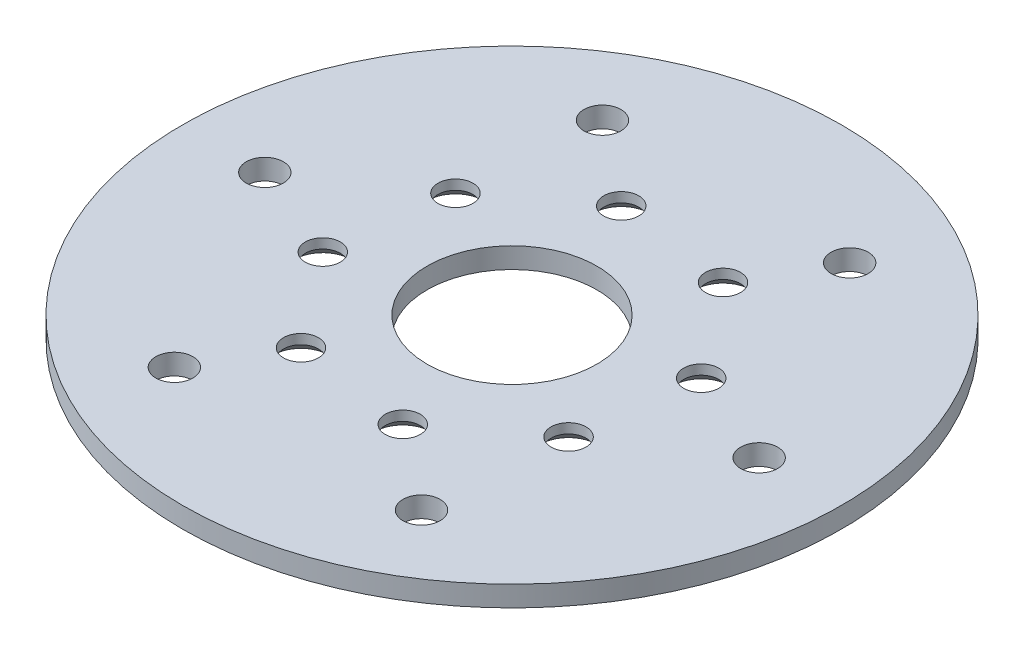
ISO-10303-21;
HEADER;
FILE_DESCRIPTION(('STEP AP214'),'2;1');
FILE_NAME('part.step','',(''),(''),'','','');
FILE_SCHEMA(('AUTOMOTIVE_DESIGN { 1 0 10303 214 1 1 1 1 }'));
ENDSEC;
DATA;
#1=APPLICATION_CONTEXT('core data for automotive mechanical design processes');
#2=APPLICATION_PROTOCOL_DEFINITION('international standard','automotive_design',2000,#1);
#3=PRODUCT_CONTEXT('',#1,'mechanical');
#4=PRODUCT('Part','Part','',(#3));
#5=PRODUCT_RELATED_PRODUCT_CATEGORY('part','',(#4));
#6=PRODUCT_DEFINITION_FORMATION('','',#4);
#7=PRODUCT_DEFINITION_CONTEXT('part definition',#1,'design');
#8=PRODUCT_DEFINITION('design','',#6,#7);
#9=PRODUCT_DEFINITION_SHAPE('','',#8);
#10=(LENGTH_UNIT() NAMED_UNIT(*) SI_UNIT(.MILLI.,.METRE.));
#11=(NAMED_UNIT(*) PLANE_ANGLE_UNIT() SI_UNIT($,.RADIAN.));
#12=(NAMED_UNIT(*) SI_UNIT($,.STERADIAN.) SOLID_ANGLE_UNIT());
#13=UNCERTAINTY_MEASURE_WITH_UNIT(LENGTH_MEASURE(1.E-05),#10,'distance_accuracy_value','');
#14=(GEOMETRIC_REPRESENTATION_CONTEXT(3) GLOBAL_UNCERTAINTY_ASSIGNED_CONTEXT((#13)) GLOBAL_UNIT_ASSIGNED_CONTEXT((#10,
#11,#12)) REPRESENTATION_CONTEXT('',''));
#15=CARTESIAN_POINT('',(0.,0.,0.));
#16=DIRECTION('',(0.,0.,1.));
#17=DIRECTION('',(1.,0.,0.));
#18=AXIS2_PLACEMENT_3D('',#15,#16,#17);
#19=CARTESIAN_POINT('',(0.,0.,0.));
#20=DIRECTION('',(0.,1.,0.));
#21=DIRECTION('',(0.,0.,1.));
#22=AXIS2_PLACEMENT_3D('',#19,#20,#21);
#23=PLANE('',#22);
#24=CARTESIAN_POINT('',(-3.88228567653796,0.,-14.4888873943352));
#25=DIRECTION('',(0.,-1.,0.));
#26=DIRECTION('',(0.,0.,-1.));
#27=AXIS2_PLACEMENT_3D('',#24,#25,#26);
#28=CIRCLE('',#27,2.75);
#29=CARTESIAN_POINT('',(-3.88228567653796,0.,-17.2388873943352));
#30=VERTEX_POINT('',#29);
#31=EDGE_CURVE('E55',#30,#30,#28,.T.);
#32=ORIENTED_EDGE('',*,*,#31,.F.);
#33=EDGE_LOOP('',(#32));
#34=FACE_BOUND('',#33,.T.);
#35=CARTESIAN_POINT('',(0.,0.,0.));
#36=DIRECTION('',(0.,1.,0.));
#37=DIRECTION('',(0.,0.,1.));
#38=AXIS2_PLACEMENT_3D('',#35,#36,#37);
#39=CIRCLE('',#38,32.);
#40=CARTESIAN_POINT('',(0.,0.,32.));
#41=VERTEX_POINT('',#40);
#42=EDGE_CURVE('E35',#41,#41,#39,.T.);
#43=ORIENTED_EDGE('',*,*,#42,.F.);
#44=EDGE_LOOP('',(#43));
#45=FACE_BOUND('',#44,.T.);
#46=CARTESIAN_POINT('',(0.,0.,0.));
#47=DIRECTION('',(0.,1.,0.));
#48=DIRECTION('',(0.,0.,1.));
#49=AXIS2_PLACEMENT_3D('',#46,#47,#48);
#50=CIRCLE('',#49,8.25);
#51=CARTESIAN_POINT('',(0.,0.,8.25));
#52=VERTEX_POINT('',#51);
#53=EDGE_CURVE('E44',#52,#52,#50,.T.);
#54=ORIENTED_EDGE('',*,*,#53,.T.);
#55=EDGE_LOOP('',(#54));
#56=FACE_BOUND('',#55,.T.);
#57=CARTESIAN_POINT('',(-12.9903810567662,0.,-7.49999999999852));
#58=DIRECTION('',(0.,-1.,0.));
#59=DIRECTION('',(0.,0.,-1.));
#60=AXIS2_PLACEMENT_3D('',#57,#58,#59);
#61=CIRCLE('',#60,2.75);
#62=CARTESIAN_POINT('',(-12.9903810567662,0.,-10.2499999999985));
#63=VERTEX_POINT('',#62);
#64=EDGE_CURVE('E64',#63,#63,#61,.T.);
#65=ORIENTED_EDGE('',*,*,#64,.F.);
#66=EDGE_LOOP('',(#65));
#67=FACE_BOUND('',#66,.T.);
#68=CARTESIAN_POINT('',(-14.4888873943348,0.,3.88228567653941));
#69=DIRECTION('',(0.,-1.,0.));
#70=DIRECTION('',(0.,0.,-1.));
#71=AXIS2_PLACEMENT_3D('',#68,#69,#70);
#72=CIRCLE('',#71,2.75);
#73=CARTESIAN_POINT('',(-14.4888873943348,0.,1.13228567653941));
#74=VERTEX_POINT('',#73);
#75=EDGE_CURVE('E73',#74,#74,#72,.T.);
#76=ORIENTED_EDGE('',*,*,#75,.F.);
#77=EDGE_LOOP('',(#76));
#78=FACE_BOUND('',#77,.T.);
#79=CARTESIAN_POINT('',(-7.49999999999815,0.,12.9903810567677));
#80=DIRECTION('',(0.,-1.,0.));
#81=DIRECTION('',(0.,0.,-1.));
#82=AXIS2_PLACEMENT_3D('',#79,#80,#81);
#83=CIRCLE('',#82,2.75);
#84=CARTESIAN_POINT('',(-7.49999999999815,0.,10.2403810567677));
#85=VERTEX_POINT('',#84);
#86=EDGE_CURVE('E82',#85,#85,#83,.T.);
#87=ORIENTED_EDGE('',*,*,#86,.F.);
#88=EDGE_LOOP('',(#87));
#89=FACE_BOUND('',#88,.T.);
#90=CARTESIAN_POINT('',(3.88228567653978,0.,14.4888873943363));
#91=DIRECTION('',(0.,-1.,0.));
#92=DIRECTION('',(0.,0.,-1.));
#93=AXIS2_PLACEMENT_3D('',#90,#91,#92);
#94=CIRCLE('',#93,2.75);
#95=CARTESIAN_POINT('',(3.88228567653978,0.,11.7388873943363));
#96=VERTEX_POINT('',#95);
#97=EDGE_CURVE('E91',#96,#96,#94,.T.);
#98=ORIENTED_EDGE('',*,*,#97,.F.);
#99=EDGE_LOOP('',(#98));
#100=FACE_BOUND('',#99,.T.);
#101=CARTESIAN_POINT('',(12.9903810567681,0.,7.4999999999993));
#102=DIRECTION('',(0.,-1.,0.));
#103=DIRECTION('',(0.,0.,-1.));
#104=AXIS2_PLACEMENT_3D('',#101,#102,#103);
#105=CIRCLE('',#104,2.75);
#106=CARTESIAN_POINT('',(12.9903810567681,0.,4.7499999999993));
#107=VERTEX_POINT('',#106);
#108=EDGE_CURVE('E100',#107,#107,#105,.T.);
#109=ORIENTED_EDGE('',*,*,#108,.F.);
#110=EDGE_LOOP('',(#109));
#111=FACE_BOUND('',#110,.T.);
#112=CARTESIAN_POINT('',(14.4888873943368,0.,-3.88228567653836));
#113=DIRECTION('',(0.,-1.,0.));
#114=DIRECTION('',(0.,0.,-1.));
#115=AXIS2_PLACEMENT_3D('',#112,#113,#114);
#116=CIRCLE('',#115,2.75);
#117=CARTESIAN_POINT('',(14.4888873943368,0.,-6.63228567653836));
#118=VERTEX_POINT('',#117);
#119=EDGE_CURVE('E109',#118,#118,#116,.T.);
#120=ORIENTED_EDGE('',*,*,#119,.F.);
#121=EDGE_LOOP('',(#120));
#122=FACE_BOUND('',#121,.T.);
#123=CARTESIAN_POINT('',(7.49999999999997,0.,-12.9903810567666));
#124=DIRECTION('',(0.,-1.,0.));
#125=DIRECTION('',(0.,0.,-1.));
#126=AXIS2_PLACEMENT_3D('',#123,#124,#125);
#127=CIRCLE('',#126,2.75);
#128=CARTESIAN_POINT('',(7.49999999999997,0.,-15.7403810567666));
#129=VERTEX_POINT('',#128);
#130=EDGE_CURVE('E118',#129,#129,#127,.T.);
#131=ORIENTED_EDGE('',*,*,#130,.F.);
#132=EDGE_LOOP('',(#131));
#133=FACE_BOUND('',#132,.T.);
#134=CARTESIAN_POINT('',(12.0000000000002,0.,20.7846096908264));
#135=DIRECTION('',(0.,-1.,0.));
#136=DIRECTION('',(0.,0.,-1.));
#137=AXIS2_PLACEMENT_3D('',#134,#135,#136);
#138=CIRCLE('',#137,1.8);
#139=CARTESIAN_POINT('',(12.0000000000002,0.,18.9846096908264));
#140=VERTEX_POINT('',#139);
#141=EDGE_CURVE('E124',#140,#140,#138,.T.);
#142=ORIENTED_EDGE('',*,*,#141,.F.);
#143=EDGE_LOOP('',(#142));
#144=FACE_BOUND('',#143,.T.);
#145=CARTESIAN_POINT('',(-11.9999999999998,0.,20.7846096908266));
#146=DIRECTION('',(0.,-1.,0.));
#147=DIRECTION('',(0.,0.,-1.));
#148=AXIS2_PLACEMENT_3D('',#145,#146,#147);
#149=CIRCLE('',#148,1.8);
#150=CARTESIAN_POINT('',(-11.9999999999998,0.,18.9846096908266));
#151=VERTEX_POINT('',#150);
#152=EDGE_CURVE('E130',#151,#151,#149,.T.);
#153=ORIENTED_EDGE('',*,*,#152,.F.);
#154=EDGE_LOOP('',(#153));
#155=FACE_BOUND('',#154,.T.);
#156=CARTESIAN_POINT('',(-24.,0.,1.6759110426447E-13));
#157=DIRECTION('',(0.,-1.,0.));
#158=DIRECTION('',(0.,0.,-1.));
#159=AXIS2_PLACEMENT_3D('',#156,#157,#158);
#160=CIRCLE('',#159,1.8);
#161=CARTESIAN_POINT('',(-24.,0.,-1.79999999999983));
#162=VERTEX_POINT('',#161);
#163=EDGE_CURVE('E136',#162,#162,#160,.T.);
#164=ORIENTED_EDGE('',*,*,#163,.F.);
#165=EDGE_LOOP('',(#164));
#166=FACE_BOUND('',#165,.T.);
#167=CARTESIAN_POINT('',(-12.0000000000001,0.,-20.7846096908265));
#168=DIRECTION('',(0.,-1.,0.));
#169=DIRECTION('',(0.,0.,-1.));
#170=AXIS2_PLACEMENT_3D('',#167,#168,#169);
#171=CIRCLE('',#170,1.8);
#172=CARTESIAN_POINT('',(-12.0000000000001,0.,-22.5846096908265));
#173=VERTEX_POINT('',#172);
#174=EDGE_CURVE('E142',#173,#173,#171,.T.);
#175=ORIENTED_EDGE('',*,*,#174,.F.);
#176=EDGE_LOOP('',(#175));
#177=FACE_BOUND('',#176,.T.);
#178=CARTESIAN_POINT('',(12.,0.,-20.7846096908266));
#179=DIRECTION('',(0.,-1.,0.));
#180=DIRECTION('',(0.,0.,-1.));
#181=AXIS2_PLACEMENT_3D('',#178,#179,#180);
#182=CIRCLE('',#181,1.8);
#183=CARTESIAN_POINT('',(12.,0.,-22.5846096908266));
#184=VERTEX_POINT('',#183);
#185=EDGE_CURVE('E148',#184,#184,#182,.T.);
#186=ORIENTED_EDGE('',*,*,#185,.F.);
#187=EDGE_LOOP('',(#186));
#188=FACE_BOUND('',#187,.T.);
#189=CARTESIAN_POINT('',(24.,0.,0.));
#190=DIRECTION('',(0.,-1.,0.));
#191=DIRECTION('',(0.,0.,-1.));
#192=AXIS2_PLACEMENT_3D('',#189,#190,#191);
#193=CIRCLE('',#192,1.8);
#194=CARTESIAN_POINT('',(24.,0.,-1.8));
#195=VERTEX_POINT('',#194);
#196=EDGE_CURVE('E154',#195,#195,#193,.T.);
#197=ORIENTED_EDGE('',*,*,#196,.F.);
#198=EDGE_LOOP('',(#197));
#199=FACE_BOUND('',#198,.T.);
#200=ADVANCED_FACE('F31',(#34,#45,#56,#67,#78,#89,#100,#111,#122,#133,#144,#155,#166,#177,#188,
#199),#23,.F.);
#201=CARTESIAN_POINT('',(0.,2.,0.));
#202=DIRECTION('',(0.,1.,0.));
#203=DIRECTION('',(0.,0.,1.));
#204=AXIS2_PLACEMENT_3D('',#201,#202,#203);
#205=PLANE('',#204);
#206=CARTESIAN_POINT('',(24.,2.,0.));
#207=DIRECTION('',(0.,1.,0.));
#208=DIRECTION('',(0.,0.,1.));
#209=AXIS2_PLACEMENT_3D('',#206,#207,#208);
#210=CIRCLE('',#209,1.8);
#211=CARTESIAN_POINT('',(24.,2.,1.8));
#212=VERTEX_POINT('',#211);
#213=EDGE_CURVE('E151',#212,#212,#210,.T.);
#214=ORIENTED_EDGE('',*,*,#213,.F.);
#215=EDGE_LOOP('',(#214));
#216=FACE_BOUND('',#215,.T.);
#217=CARTESIAN_POINT('',(12.,2.,-20.7846096908266));
#218=DIRECTION('',(0.,1.,0.));
#219=DIRECTION('',(0.,0.,1.));
#220=AXIS2_PLACEMENT_3D('',#217,#218,#219);
#221=CIRCLE('',#220,1.8);
#222=CARTESIAN_POINT('',(12.,2.,-18.9846096908266));
#223=VERTEX_POINT('',#222);
#224=EDGE_CURVE('E145',#223,#223,#221,.T.);
#225=ORIENTED_EDGE('',*,*,#224,.F.);
#226=EDGE_LOOP('',(#225));
#227=FACE_BOUND('',#226,.T.);
#228=CARTESIAN_POINT('',(-12.0000000000001,2.,-20.7846096908265));
#229=DIRECTION('',(0.,1.,0.));
#230=DIRECTION('',(0.,0.,1.));
#231=AXIS2_PLACEMENT_3D('',#228,#229,#230);
#232=CIRCLE('',#231,1.8);
#233=CARTESIAN_POINT('',(-12.0000000000001,2.,-18.9846096908265));
#234=VERTEX_POINT('',#233);
#235=EDGE_CURVE('E139',#234,#234,#232,.T.);
#236=ORIENTED_EDGE('',*,*,#235,.F.);
#237=EDGE_LOOP('',(#236));
#238=FACE_BOUND('',#237,.T.);
#239=CARTESIAN_POINT('',(-24.,2.,1.6759110426447E-13));
#240=DIRECTION('',(0.,1.,0.));
#241=DIRECTION('',(0.,0.,1.));
#242=AXIS2_PLACEMENT_3D('',#239,#240,#241);
#243=CIRCLE('',#242,1.8);
#244=CARTESIAN_POINT('',(-24.,2.,1.80000000000017));
#245=VERTEX_POINT('',#244);
#246=EDGE_CURVE('E133',#245,#245,#243,.T.);
#247=ORIENTED_EDGE('',*,*,#246,.F.);
#248=EDGE_LOOP('',(#247));
#249=FACE_BOUND('',#248,.T.);
#250=CARTESIAN_POINT('',(-11.9999999999998,2.,20.7846096908266));
#251=DIRECTION('',(0.,1.,0.));
#252=DIRECTION('',(0.,0.,1.));
#253=AXIS2_PLACEMENT_3D('',#250,#251,#252);
#254=CIRCLE('',#253,1.8);
#255=CARTESIAN_POINT('',(-11.9999999999998,2.,22.5846096908266));
#256=VERTEX_POINT('',#255);
#257=EDGE_CURVE('E127',#256,#256,#254,.T.);
#258=ORIENTED_EDGE('',*,*,#257,.F.);
#259=EDGE_LOOP('',(#258));
#260=FACE_BOUND('',#259,.T.);
#261=CARTESIAN_POINT('',(12.0000000000002,2.,20.7846096908264));
#262=DIRECTION('',(0.,1.,0.));
#263=DIRECTION('',(0.,0.,1.));
#264=AXIS2_PLACEMENT_3D('',#261,#262,#263);
#265=CIRCLE('',#264,1.8);
#266=CARTESIAN_POINT('',(12.0000000000002,2.,22.5846096908264));
#267=VERTEX_POINT('',#266);
#268=EDGE_CURVE('E121',#267,#267,#265,.T.);
#269=ORIENTED_EDGE('',*,*,#268,.F.);
#270=EDGE_LOOP('',(#269));
#271=FACE_BOUND('',#270,.T.);
#272=CARTESIAN_POINT('',(7.49999999999997,2.,-12.9903810567666));
#273=DIRECTION('',(0.,1.,0.));
#274=DIRECTION('',(0.,0.,1.));
#275=AXIS2_PLACEMENT_3D('',#272,#273,#274);
#276=CIRCLE('',#275,1.7);
#277=CARTESIAN_POINT('',(7.49999999999997,2.,-11.2903810567666));
#278=VERTEX_POINT('',#277);
#279=EDGE_CURVE('E112',#278,#278,#276,.T.);
#280=ORIENTED_EDGE('',*,*,#279,.F.);
#281=EDGE_LOOP('',(#280));
#282=FACE_BOUND('',#281,.T.);
#283=CARTESIAN_POINT('',(14.4888873943368,2.,-3.88228567653836));
#284=DIRECTION('',(0.,1.,0.));
#285=DIRECTION('',(0.,0.,1.));
#286=AXIS2_PLACEMENT_3D('',#283,#284,#285);
#287=CIRCLE('',#286,1.7);
#288=CARTESIAN_POINT('',(14.4888873943368,2.,-2.18228567653836));
#289=VERTEX_POINT('',#288);
#290=EDGE_CURVE('E103',#289,#289,#287,.T.);
#291=ORIENTED_EDGE('',*,*,#290,.F.);
#292=EDGE_LOOP('',(#291));
#293=FACE_BOUND('',#292,.T.);
#294=CARTESIAN_POINT('',(12.9903810567681,2.,7.4999999999993));
#295=DIRECTION('',(0.,1.,0.));
#296=DIRECTION('',(0.,0.,1.));
#297=AXIS2_PLACEMENT_3D('',#294,#295,#296);
#298=CIRCLE('',#297,1.7);
#299=CARTESIAN_POINT('',(12.9903810567681,2.,9.1999999999993));
#300=VERTEX_POINT('',#299);
#301=EDGE_CURVE('E94',#300,#300,#298,.T.);
#302=ORIENTED_EDGE('',*,*,#301,.F.);
#303=EDGE_LOOP('',(#302));
#304=FACE_BOUND('',#303,.T.);
#305=CARTESIAN_POINT('',(3.88228567653978,2.,14.4888873943363));
#306=DIRECTION('',(0.,1.,0.));
#307=DIRECTION('',(0.,0.,1.));
#308=AXIS2_PLACEMENT_3D('',#305,#306,#307);
#309=CIRCLE('',#308,1.7);
#310=CARTESIAN_POINT('',(3.88228567653978,2.,16.1888873943363));
#311=VERTEX_POINT('',#310);
#312=EDGE_CURVE('E85',#311,#311,#309,.T.);
#313=ORIENTED_EDGE('',*,*,#312,.F.);
#314=EDGE_LOOP('',(#313));
#315=FACE_BOUND('',#314,.T.);
#316=CARTESIAN_POINT('',(-7.49999999999815,2.,12.9903810567677));
#317=DIRECTION('',(0.,1.,0.));
#318=DIRECTION('',(0.,0.,1.));
#319=AXIS2_PLACEMENT_3D('',#316,#317,#318);
#320=CIRCLE('',#319,1.7);
#321=CARTESIAN_POINT('',(-7.49999999999815,2.,14.6903810567677));
#322=VERTEX_POINT('',#321);
#323=EDGE_CURVE('E76',#322,#322,#320,.T.);
#324=ORIENTED_EDGE('',*,*,#323,.F.);
#325=EDGE_LOOP('',(#324));
#326=FACE_BOUND('',#325,.T.);
#327=CARTESIAN_POINT('',(-14.4888873943348,2.,3.88228567653941));
#328=DIRECTION('',(0.,1.,0.));
#329=DIRECTION('',(0.,0.,1.));
#330=AXIS2_PLACEMENT_3D('',#327,#328,#329);
#331=CIRCLE('',#330,1.7);
#332=CARTESIAN_POINT('',(-14.4888873943348,2.,5.58228567653941));
#333=VERTEX_POINT('',#332);
#334=EDGE_CURVE('E67',#333,#333,#331,.T.);
#335=ORIENTED_EDGE('',*,*,#334,.F.);
#336=EDGE_LOOP('',(#335));
#337=FACE_BOUND('',#336,.T.);
#338=CARTESIAN_POINT('',(-12.9903810567662,2.,-7.49999999999852));
#339=DIRECTION('',(0.,1.,0.));
#340=DIRECTION('',(0.,0.,1.));
#341=AXIS2_PLACEMENT_3D('',#338,#339,#340);
#342=CIRCLE('',#341,1.7);
#343=CARTESIAN_POINT('',(-12.9903810567662,2.,-5.79999999999852));
#344=VERTEX_POINT('',#343);
#345=EDGE_CURVE('E58',#344,#344,#342,.T.);
#346=ORIENTED_EDGE('',*,*,#345,.F.);
#347=EDGE_LOOP('',(#346));
#348=FACE_BOUND('',#347,.T.);
#349=CARTESIAN_POINT('',(-3.88228567653796,2.,-14.4888873943352));
#350=DIRECTION('',(0.,1.,0.));
#351=DIRECTION('',(0.,0.,1.));
#352=AXIS2_PLACEMENT_3D('',#349,#350,#351);
#353=CIRCLE('',#352,1.7);
#354=CARTESIAN_POINT('',(-3.88228567653796,2.,-12.7888873943352));
#355=VERTEX_POINT('',#354);
#356=EDGE_CURVE('E47',#355,#355,#353,.T.);
#357=ORIENTED_EDGE('',*,*,#356,.F.);
#358=EDGE_LOOP('',(#357));
#359=FACE_BOUND('',#358,.T.);
#360=CARTESIAN_POINT('',(0.,2.,0.));
#361=DIRECTION('',(0.,1.,0.));
#362=DIRECTION('',(0.,0.,1.));
#363=AXIS2_PLACEMENT_3D('',#360,#361,#362);
#364=CIRCLE('',#363,32.);
#365=CARTESIAN_POINT('',(0.,2.,32.));
#366=VERTEX_POINT('',#365);
#367=EDGE_CURVE('E10',#366,#366,#364,.T.);
#368=ORIENTED_EDGE('',*,*,#367,.T.);
#369=EDGE_LOOP('',(#368));
#370=FACE_BOUND('',#369,.T.);
#371=CARTESIAN_POINT('',(0.,2.,0.));
#372=DIRECTION('',(0.,1.,0.));
#373=DIRECTION('',(0.,0.,1.));
#374=AXIS2_PLACEMENT_3D('',#371,#372,#373);
#375=CIRCLE('',#374,8.25);
#376=CARTESIAN_POINT('',(0.,2.,8.25));
#377=VERTEX_POINT('',#376);
#378=EDGE_CURVE('E42',#377,#377,#375,.T.);
#379=ORIENTED_EDGE('',*,*,#378,.F.);
#380=EDGE_LOOP('',(#379));
#381=FACE_BOUND('',#380,.T.);
#382=ADVANCED_FACE('F162',(#216,#227,#238,#249,#260,#271,#282,#293,#304,#315,#326,#337,#348,
#359,#370,#381),#205,.T.);
#383=CARTESIAN_POINT('',(0.,2.,0.));
#384=DIRECTION('',(0.,-1.,0.));
#385=DIRECTION('',(0.,0.,-1.));
#386=AXIS2_PLACEMENT_3D('',#383,#384,#385);
#387=CYLINDRICAL_SURFACE('',#386,32.);
#388=ORIENTED_EDGE('',*,*,#367,.F.);
#389=EDGE_LOOP('',(#388));
#390=FACE_BOUND('',#389,.T.);
#391=ORIENTED_EDGE('',*,*,#42,.T.);
#392=EDGE_LOOP('',(#391));
#393=FACE_BOUND('',#392,.T.);
#394=ADVANCED_FACE('F33',(#390,#393),#387,.T.);
#395=CARTESIAN_POINT('',(0.,2.,0.));
#396=DIRECTION('',(0.,-1.,0.));
#397=DIRECTION('',(0.,0.,-1.));
#398=AXIS2_PLACEMENT_3D('',#395,#396,#397);
#399=CYLINDRICAL_SURFACE('',#398,8.25);
#400=ORIENTED_EDGE('',*,*,#378,.T.);
#401=EDGE_LOOP('',(#400));
#402=FACE_BOUND('',#401,.T.);
#403=ORIENTED_EDGE('',*,*,#53,.F.);
#404=EDGE_LOOP('',(#403));
#405=FACE_BOUND('',#404,.T.);
#406=ADVANCED_FACE('F172',(#402,#405),#399,.F.);
#407=CARTESIAN_POINT('',(-3.88228567653796,0.,-14.4888873943352));
#408=DIRECTION('',(0.,-1.,0.));
#409=DIRECTION('',(0.,0.,-1.));
#410=AXIS2_PLACEMENT_3D('',#407,#408,#409);
#411=CYLINDRICAL_SURFACE('',#410,1.7);
#412=CARTESIAN_POINT('',(-3.88228567653796,1.05,-14.4888873943352));
#413=DIRECTION('',(0.,-1.,0.));
#414=DIRECTION('',(0.,0.,-1.));
#415=AXIS2_PLACEMENT_3D('',#412,#413,#414);
#416=CIRCLE('',#415,1.7);
#417=CARTESIAN_POINT('',(-3.88228567653796,1.05,-16.1888873943352));
#418=VERTEX_POINT('',#417);
#419=EDGE_CURVE('E52',#418,#418,#416,.T.);
#420=ORIENTED_EDGE('',*,*,#419,.T.);
#421=EDGE_LOOP('',(#420));
#422=FACE_BOUND('',#421,.T.);
#423=ORIENTED_EDGE('',*,*,#356,.T.);
#424=EDGE_LOOP('',(#423));
#425=FACE_BOUND('',#424,.T.);
#426=ADVANCED_FACE('F175',(#422,#425),#411,.F.);
#427=CARTESIAN_POINT('',(-3.88228567653796,0.,-14.4888873943352));
#428=DIRECTION('',(0.,-1.,0.));
#429=DIRECTION('',(0.,0.,-1.));
#430=AXIS2_PLACEMENT_3D('',#427,#428,#429);
#431=CONICAL_SURFACE('',#430,2.75,0.785398163397448);
#432=ORIENTED_EDGE('',*,*,#419,.F.);
#433=EDGE_LOOP('',(#432));
#434=FACE_BOUND('',#433,.T.);
#435=ORIENTED_EDGE('',*,*,#31,.T.);
#436=EDGE_LOOP('',(#435));
#437=FACE_BOUND('',#436,.T.);
#438=ADVANCED_FACE('F179',(#434,#437),#431,.F.);
#439=CARTESIAN_POINT('',(-12.9903810567662,0.,-7.49999999999852));
#440=DIRECTION('',(0.,-1.,0.));
#441=DIRECTION('',(0.,0.,-1.));
#442=AXIS2_PLACEMENT_3D('',#439,#440,#441);
#443=CYLINDRICAL_SURFACE('',#442,1.7);
#444=CARTESIAN_POINT('',(-12.9903810567662,1.05,-7.49999999999852));
#445=DIRECTION('',(0.,-1.,0.));
#446=DIRECTION('',(0.,0.,-1.));
#447=AXIS2_PLACEMENT_3D('',#444,#445,#446);
#448=CIRCLE('',#447,1.7);
#449=CARTESIAN_POINT('',(-12.9903810567662,1.05,-9.19999999999852));
#450=VERTEX_POINT('',#449);
#451=EDGE_CURVE('E61',#450,#450,#448,.T.);
#452=ORIENTED_EDGE('',*,*,#451,.T.);
#453=EDGE_LOOP('',(#452));
#454=FACE_BOUND('',#453,.T.);
#455=ORIENTED_EDGE('',*,*,#345,.T.);
#456=EDGE_LOOP('',(#455));
#457=FACE_BOUND('',#456,.T.);
#458=ADVANCED_FACE('F183',(#454,#457),#443,.F.);
#459=CARTESIAN_POINT('',(-12.9903810567662,0.,-7.49999999999852));
#460=DIRECTION('',(0.,-1.,0.));
#461=DIRECTION('',(0.,0.,-1.));
#462=AXIS2_PLACEMENT_3D('',#459,#460,#461);
#463=CONICAL_SURFACE('',#462,2.75,0.785398163397447);
#464=ORIENTED_EDGE('',*,*,#451,.F.);
#465=EDGE_LOOP('',(#464));
#466=FACE_BOUND('',#465,.T.);
#467=ORIENTED_EDGE('',*,*,#64,.T.);
#468=EDGE_LOOP('',(#467));
#469=FACE_BOUND('',#468,.T.);
#470=ADVANCED_FACE('F187',(#466,#469),#463,.F.);
#471=CARTESIAN_POINT('',(-14.4888873943348,0.,3.88228567653941));
#472=DIRECTION('',(0.,-1.,0.));
#473=DIRECTION('',(0.,0.,-1.));
#474=AXIS2_PLACEMENT_3D('',#471,#472,#473);
#475=CYLINDRICAL_SURFACE('',#474,1.7);
#476=CARTESIAN_POINT('',(-14.4888873943348,1.05,3.88228567653941));
#477=DIRECTION('',(0.,-1.,0.));
#478=DIRECTION('',(0.,0.,-1.));
#479=AXIS2_PLACEMENT_3D('',#476,#477,#478);
#480=CIRCLE('',#479,1.7);
#481=CARTESIAN_POINT('',(-14.4888873943348,1.05,2.18228567653941));
#482=VERTEX_POINT('',#481);
#483=EDGE_CURVE('E70',#482,#482,#480,.T.);
#484=ORIENTED_EDGE('',*,*,#483,.T.);
#485=EDGE_LOOP('',(#484));
#486=FACE_BOUND('',#485,.T.);
#487=ORIENTED_EDGE('',*,*,#334,.T.);
#488=EDGE_LOOP('',(#487));
#489=FACE_BOUND('',#488,.T.);
#490=ADVANCED_FACE('F191',(#486,#489),#475,.F.);
#491=CARTESIAN_POINT('',(-14.4888873943348,0.,3.88228567653941));
#492=DIRECTION('',(0.,-1.,0.));
#493=DIRECTION('',(0.,0.,-1.));
#494=AXIS2_PLACEMENT_3D('',#491,#492,#493);
#495=CONICAL_SURFACE('',#494,2.75,0.785398163397448);
#496=ORIENTED_EDGE('',*,*,#483,.F.);
#497=EDGE_LOOP('',(#496));
#498=FACE_BOUND('',#497,.T.);
#499=ORIENTED_EDGE('',*,*,#75,.T.);
#500=EDGE_LOOP('',(#499));
#501=FACE_BOUND('',#500,.T.);
#502=ADVANCED_FACE('F195',(#498,#501),#495,.F.);
#503=CARTESIAN_POINT('',(-7.49999999999815,0.,12.9903810567677));
#504=DIRECTION('',(0.,-1.,0.));
#505=DIRECTION('',(0.,0.,-1.));
#506=AXIS2_PLACEMENT_3D('',#503,#504,#505);
#507=CYLINDRICAL_SURFACE('',#506,1.7);
#508=CARTESIAN_POINT('',(-7.49999999999815,1.05,12.9903810567677));
#509=DIRECTION('',(0.,-1.,0.));
#510=DIRECTION('',(0.,0.,-1.));
#511=AXIS2_PLACEMENT_3D('',#508,#509,#510);
#512=CIRCLE('',#511,1.7);
#513=CARTESIAN_POINT('',(-7.49999999999815,1.05,11.2903810567677));
#514=VERTEX_POINT('',#513);
#515=EDGE_CURVE('E79',#514,#514,#512,.T.);
#516=ORIENTED_EDGE('',*,*,#515,.T.);
#517=EDGE_LOOP('',(#516));
#518=FACE_BOUND('',#517,.T.);
#519=ORIENTED_EDGE('',*,*,#323,.T.);
#520=EDGE_LOOP('',(#519));
#521=FACE_BOUND('',#520,.T.);
#522=ADVANCED_FACE('F199',(#518,#521),#507,.F.);
#523=CARTESIAN_POINT('',(-7.49999999999815,0.,12.9903810567677));
#524=DIRECTION('',(0.,-1.,0.));
#525=DIRECTION('',(0.,0.,-1.));
#526=AXIS2_PLACEMENT_3D('',#523,#524,#525);
#527=CONICAL_SURFACE('',#526,2.75,0.785398163397448);
#528=ORIENTED_EDGE('',*,*,#515,.F.);
#529=EDGE_LOOP('',(#528));
#530=FACE_BOUND('',#529,.T.);
#531=ORIENTED_EDGE('',*,*,#86,.T.);
#532=EDGE_LOOP('',(#531));
#533=FACE_BOUND('',#532,.T.);
#534=ADVANCED_FACE('F203',(#530,#533),#527,.F.);
#535=CARTESIAN_POINT('',(3.88228567653978,0.,14.4888873943363));
#536=DIRECTION('',(0.,-1.,0.));
#537=DIRECTION('',(0.,0.,-1.));
#538=AXIS2_PLACEMENT_3D('',#535,#536,#537);
#539=CYLINDRICAL_SURFACE('',#538,1.7);
#540=CARTESIAN_POINT('',(3.88228567653978,1.05,14.4888873943363));
#541=DIRECTION('',(0.,-1.,0.));
#542=DIRECTION('',(0.,0.,-1.));
#543=AXIS2_PLACEMENT_3D('',#540,#541,#542);
#544=CIRCLE('',#543,1.7);
#545=CARTESIAN_POINT('',(3.88228567653978,1.05,12.7888873943363));
#546=VERTEX_POINT('',#545);
#547=EDGE_CURVE('E88',#546,#546,#544,.T.);
#548=ORIENTED_EDGE('',*,*,#547,.T.);
#549=EDGE_LOOP('',(#548));
#550=FACE_BOUND('',#549,.T.);
#551=ORIENTED_EDGE('',*,*,#312,.T.);
#552=EDGE_LOOP('',(#551));
#553=FACE_BOUND('',#552,.T.);
#554=ADVANCED_FACE('F207',(#550,#553),#539,.F.);
#555=CARTESIAN_POINT('',(3.88228567653978,0.,14.4888873943363));
#556=DIRECTION('',(0.,-1.,0.));
#557=DIRECTION('',(0.,0.,-1.));
#558=AXIS2_PLACEMENT_3D('',#555,#556,#557);
#559=CONICAL_SURFACE('',#558,2.75,0.785398163397448);
#560=ORIENTED_EDGE('',*,*,#547,.F.);
#561=EDGE_LOOP('',(#560));
#562=FACE_BOUND('',#561,.T.);
#563=ORIENTED_EDGE('',*,*,#97,.T.);
#564=EDGE_LOOP('',(#563));
#565=FACE_BOUND('',#564,.T.);
#566=ADVANCED_FACE('F211',(#562,#565),#559,.F.);
#567=CARTESIAN_POINT('',(12.9903810567681,0.,7.4999999999993));
#568=DIRECTION('',(0.,-1.,0.));
#569=DIRECTION('',(0.,0.,-1.));
#570=AXIS2_PLACEMENT_3D('',#567,#568,#569);
#571=CYLINDRICAL_SURFACE('',#570,1.7);
#572=CARTESIAN_POINT('',(12.9903810567681,1.05,7.4999999999993));
#573=DIRECTION('',(0.,-1.,0.));
#574=DIRECTION('',(0.,0.,-1.));
#575=AXIS2_PLACEMENT_3D('',#572,#573,#574);
#576=CIRCLE('',#575,1.7);
#577=CARTESIAN_POINT('',(12.9903810567681,1.05,5.7999999999993));
#578=VERTEX_POINT('',#577);
#579=EDGE_CURVE('E97',#578,#578,#576,.T.);
#580=ORIENTED_EDGE('',*,*,#579,.T.);
#581=EDGE_LOOP('',(#580));
#582=FACE_BOUND('',#581,.T.);
#583=ORIENTED_EDGE('',*,*,#301,.T.);
#584=EDGE_LOOP('',(#583));
#585=FACE_BOUND('',#584,.T.);
#586=ADVANCED_FACE('F215',(#582,#585),#571,.F.);
#587=CARTESIAN_POINT('',(12.9903810567681,0.,7.4999999999993));
#588=DIRECTION('',(0.,-1.,0.));
#589=DIRECTION('',(0.,0.,-1.));
#590=AXIS2_PLACEMENT_3D('',#587,#588,#589);
#591=CONICAL_SURFACE('',#590,2.75,0.785398163397448);
#592=ORIENTED_EDGE('',*,*,#579,.F.);
#593=EDGE_LOOP('',(#592));
#594=FACE_BOUND('',#593,.T.);
#595=ORIENTED_EDGE('',*,*,#108,.T.);
#596=EDGE_LOOP('',(#595));
#597=FACE_BOUND('',#596,.T.);
#598=ADVANCED_FACE('F219',(#594,#597),#591,.F.);
#599=CARTESIAN_POINT('',(14.4888873943368,0.,-3.88228567653836));
#600=DIRECTION('',(0.,-1.,0.));
#601=DIRECTION('',(0.,0.,-1.));
#602=AXIS2_PLACEMENT_3D('',#599,#600,#601);
#603=CYLINDRICAL_SURFACE('',#602,1.7);
#604=CARTESIAN_POINT('',(14.4888873943368,1.05,-3.88228567653836));
#605=DIRECTION('',(0.,-1.,0.));
#606=DIRECTION('',(0.,0.,-1.));
#607=AXIS2_PLACEMENT_3D('',#604,#605,#606);
#608=CIRCLE('',#607,1.7);
#609=CARTESIAN_POINT('',(14.4888873943368,1.05,-5.58228567653836));
#610=VERTEX_POINT('',#609);
#611=EDGE_CURVE('E106',#610,#610,#608,.T.);
#612=ORIENTED_EDGE('',*,*,#611,.T.);
#613=EDGE_LOOP('',(#612));
#614=FACE_BOUND('',#613,.T.);
#615=ORIENTED_EDGE('',*,*,#290,.T.);
#616=EDGE_LOOP('',(#615));
#617=FACE_BOUND('',#616,.T.);
#618=ADVANCED_FACE('F223',(#614,#617),#603,.F.);
#619=CARTESIAN_POINT('',(14.4888873943368,0.,-3.88228567653836));
#620=DIRECTION('',(0.,-1.,0.));
#621=DIRECTION('',(0.,0.,-1.));
#622=AXIS2_PLACEMENT_3D('',#619,#620,#621);
#623=CONICAL_SURFACE('',#622,2.75,0.785398163397447);
#624=ORIENTED_EDGE('',*,*,#611,.F.);
#625=EDGE_LOOP('',(#624));
#626=FACE_BOUND('',#625,.T.);
#627=ORIENTED_EDGE('',*,*,#119,.T.);
#628=EDGE_LOOP('',(#627));
#629=FACE_BOUND('',#628,.T.);
#630=ADVANCED_FACE('F227',(#626,#629),#623,.F.);
#631=CARTESIAN_POINT('',(7.49999999999997,0.,-12.9903810567666));
#632=DIRECTION('',(0.,-1.,0.));
#633=DIRECTION('',(0.,0.,-1.));
#634=AXIS2_PLACEMENT_3D('',#631,#632,#633);
#635=CYLINDRICAL_SURFACE('',#634,1.7);
#636=CARTESIAN_POINT('',(7.49999999999997,1.05,-12.9903810567666));
#637=DIRECTION('',(0.,-1.,0.));
#638=DIRECTION('',(0.,0.,-1.));
#639=AXIS2_PLACEMENT_3D('',#636,#637,#638);
#640=CIRCLE('',#639,1.7);
#641=CARTESIAN_POINT('',(7.49999999999997,1.05,-14.6903810567666));
#642=VERTEX_POINT('',#641);
#643=EDGE_CURVE('E115',#642,#642,#640,.T.);
#644=ORIENTED_EDGE('',*,*,#643,.T.);
#645=EDGE_LOOP('',(#644));
#646=FACE_BOUND('',#645,.T.);
#647=ORIENTED_EDGE('',*,*,#279,.T.);
#648=EDGE_LOOP('',(#647));
#649=FACE_BOUND('',#648,.T.);
#650=ADVANCED_FACE('F231',(#646,#649),#635,.F.);
#651=CARTESIAN_POINT('',(7.49999999999997,0.,-12.9903810567666));
#652=DIRECTION('',(0.,-1.,0.));
#653=DIRECTION('',(0.,0.,-1.));
#654=AXIS2_PLACEMENT_3D('',#651,#652,#653);
#655=CONICAL_SURFACE('',#654,2.75,0.785398163397448);
#656=ORIENTED_EDGE('',*,*,#643,.F.);
#657=EDGE_LOOP('',(#656));
#658=FACE_BOUND('',#657,.T.);
#659=ORIENTED_EDGE('',*,*,#130,.T.);
#660=EDGE_LOOP('',(#659));
#661=FACE_BOUND('',#660,.T.);
#662=ADVANCED_FACE('F235',(#658,#661),#655,.F.);
#663=CARTESIAN_POINT('',(12.0000000000002,0.,20.7846096908264));
#664=DIRECTION('',(0.,-1.,0.));
#665=DIRECTION('',(0.,0.,-1.));
#666=AXIS2_PLACEMENT_3D('',#663,#664,#665);
#667=CYLINDRICAL_SURFACE('',#666,1.8);
#668=ORIENTED_EDGE('',*,*,#141,.T.);
#669=EDGE_LOOP('',(#668));
#670=FACE_BOUND('',#669,.T.);
#671=ORIENTED_EDGE('',*,*,#268,.T.);
#672=EDGE_LOOP('',(#671));
#673=FACE_BOUND('',#672,.T.);
#674=ADVANCED_FACE('F239',(#670,#673),#667,.F.);
#675=CARTESIAN_POINT('',(-11.9999999999998,0.,20.7846096908266));
#676=DIRECTION('',(0.,-1.,0.));
#677=DIRECTION('',(0.,0.,-1.));
#678=AXIS2_PLACEMENT_3D('',#675,#676,#677);
#679=CYLINDRICAL_SURFACE('',#678,1.8);
#680=ORIENTED_EDGE('',*,*,#152,.T.);
#681=EDGE_LOOP('',(#680));
#682=FACE_BOUND('',#681,.T.);
#683=ORIENTED_EDGE('',*,*,#257,.T.);
#684=EDGE_LOOP('',(#683));
#685=FACE_BOUND('',#684,.T.);
#686=ADVANCED_FACE('F243',(#682,#685),#679,.F.);
#687=CARTESIAN_POINT('',(-24.,0.,1.6759110426447E-13));
#688=DIRECTION('',(0.,-1.,0.));
#689=DIRECTION('',(0.,0.,-1.));
#690=AXIS2_PLACEMENT_3D('',#687,#688,#689);
#691=CYLINDRICAL_SURFACE('',#690,1.8);
#692=ORIENTED_EDGE('',*,*,#163,.T.);
#693=EDGE_LOOP('',(#692));
#694=FACE_BOUND('',#693,.T.);
#695=ORIENTED_EDGE('',*,*,#246,.T.);
#696=EDGE_LOOP('',(#695));
#697=FACE_BOUND('',#696,.T.);
#698=ADVANCED_FACE('F247',(#694,#697),#691,.F.);
#699=CARTESIAN_POINT('',(-12.0000000000001,0.,-20.7846096908265));
#700=DIRECTION('',(0.,-1.,0.));
#701=DIRECTION('',(0.,0.,-1.));
#702=AXIS2_PLACEMENT_3D('',#699,#700,#701);
#703=CYLINDRICAL_SURFACE('',#702,1.8);
#704=ORIENTED_EDGE('',*,*,#174,.T.);
#705=EDGE_LOOP('',(#704));
#706=FACE_BOUND('',#705,.T.);
#707=ORIENTED_EDGE('',*,*,#235,.T.);
#708=EDGE_LOOP('',(#707));
#709=FACE_BOUND('',#708,.T.);
#710=ADVANCED_FACE('F251',(#706,#709),#703,.F.);
#711=CARTESIAN_POINT('',(12.,0.,-20.7846096908266));
#712=DIRECTION('',(0.,-1.,0.));
#713=DIRECTION('',(0.,0.,-1.));
#714=AXIS2_PLACEMENT_3D('',#711,#712,#713);
#715=CYLINDRICAL_SURFACE('',#714,1.8);
#716=ORIENTED_EDGE('',*,*,#185,.T.);
#717=EDGE_LOOP('',(#716));
#718=FACE_BOUND('',#717,.T.);
#719=ORIENTED_EDGE('',*,*,#224,.T.);
#720=EDGE_LOOP('',(#719));
#721=FACE_BOUND('',#720,.T.);
#722=ADVANCED_FACE('F255',(#718,#721),#715,.F.);
#723=CARTESIAN_POINT('',(24.,0.,0.));
#724=DIRECTION('',(0.,-1.,0.));
#725=DIRECTION('',(0.,0.,-1.));
#726=AXIS2_PLACEMENT_3D('',#723,#724,#725);
#727=CYLINDRICAL_SURFACE('',#726,1.8);
#728=ORIENTED_EDGE('',*,*,#196,.T.);
#729=EDGE_LOOP('',(#728));
#730=FACE_BOUND('',#729,.T.);
#731=ORIENTED_EDGE('',*,*,#213,.T.);
#732=EDGE_LOOP('',(#731));
#733=FACE_BOUND('',#732,.T.);
#734=ADVANCED_FACE('F158',(#730,#733),#727,.F.);
#735=CLOSED_SHELL('',(#200,#382,#394,#406,#426,#438,#458,#470,#490,#502,#522,#534,#554,#566,
#586,#598,#618,#630,#650,#662,#674,#686,#698,#710,#722,#734));
#736=MANIFOLD_SOLID_BREP('B2',#735);
#737=ADVANCED_BREP_SHAPE_REPRESENTATION('',(#18,#736),#14);
#738=SHAPE_DEFINITION_REPRESENTATION(#9,#737);
ENDSEC;
END-ISO-10303-21;
